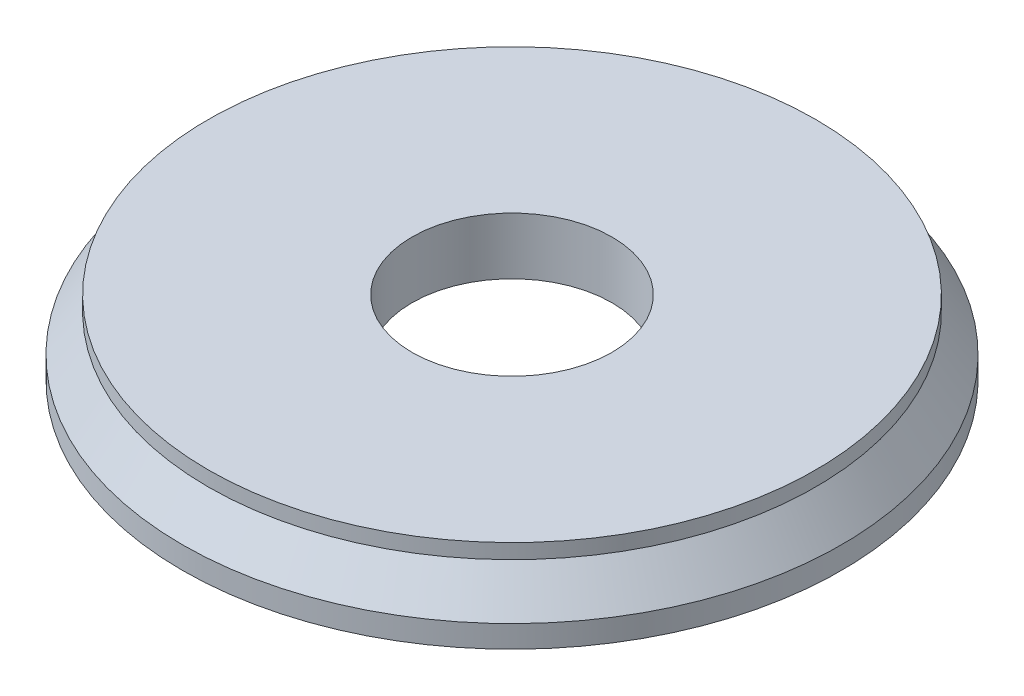
ISO-10303-21;
HEADER;
FILE_DESCRIPTION(('STEP AP214'),'2;1');
FILE_NAME('part.step','',(''),(''),'','','');
FILE_SCHEMA(('AUTOMOTIVE_DESIGN { 1 0 10303 214 1 1 1 1 }'));
ENDSEC;
DATA;
#1=APPLICATION_CONTEXT('core data for automotive mechanical design processes');
#2=APPLICATION_PROTOCOL_DEFINITION('international standard','automotive_design',2000,#1);
#3=PRODUCT_CONTEXT('',#1,'mechanical');
#4=PRODUCT('Part','Part','',(#3));
#5=PRODUCT_RELATED_PRODUCT_CATEGORY('part','',(#4));
#6=PRODUCT_DEFINITION_FORMATION('','',#4);
#7=PRODUCT_DEFINITION_CONTEXT('part definition',#1,'design');
#8=PRODUCT_DEFINITION('design','',#6,#7);
#9=PRODUCT_DEFINITION_SHAPE('','',#8);
#10=(LENGTH_UNIT() NAMED_UNIT(*) SI_UNIT(.MILLI.,.METRE.));
#11=(NAMED_UNIT(*) PLANE_ANGLE_UNIT() SI_UNIT($,.RADIAN.));
#12=(NAMED_UNIT(*) SI_UNIT($,.STERADIAN.) SOLID_ANGLE_UNIT());
#13=UNCERTAINTY_MEASURE_WITH_UNIT(LENGTH_MEASURE(1.E-05),#10,'distance_accuracy_value','');
#14=(GEOMETRIC_REPRESENTATION_CONTEXT(3) GLOBAL_UNCERTAINTY_ASSIGNED_CONTEXT((#13)) GLOBAL_UNIT_ASSIGNED_CONTEXT((#10,
#11,#12)) REPRESENTATION_CONTEXT('',''));
#15=CARTESIAN_POINT('',(0.,0.,0.));
#16=DIRECTION('',(0.,0.,1.));
#17=DIRECTION('',(1.,0.,0.));
#18=AXIS2_PLACEMENT_3D('',#15,#16,#17);
#19=CARTESIAN_POINT('',(0.,0.,0.));
#20=DIRECTION('',(0.,-1.,0.));
#21=DIRECTION('',(0.,0.,-1.));
#22=AXIS2_PLACEMENT_3D('',#19,#20,#21);
#23=CYLINDRICAL_SURFACE('',#22,44.5);
#24=CARTESIAN_POINT('',(0.,3.,0.));
#25=DIRECTION('',(0.,-1.,0.));
#26=DIRECTION('',(0.,0.,-1.));
#27=AXIS2_PLACEMENT_3D('',#24,#25,#26);
#28=CIRCLE('',#27,44.5);
#29=CARTESIAN_POINT('',(0.,3.,-44.5));
#30=VERTEX_POINT('',#29);
#31=EDGE_CURVE('E55',#30,#30,#28,.T.);
#32=ORIENTED_EDGE('',*,*,#31,.T.);
#33=EDGE_LOOP('',(#32));
#34=FACE_BOUND('',#33,.T.);
#35=CARTESIAN_POINT('',(0.,0.,0.));
#36=DIRECTION('',(0.,-1.,0.));
#37=DIRECTION('',(0.,0.,-1.));
#38=AXIS2_PLACEMENT_3D('',#35,#36,#37);
#39=CIRCLE('',#38,44.5);
#40=CARTESIAN_POINT('',(0.,0.,-44.5));
#41=VERTEX_POINT('',#40);
#42=EDGE_CURVE('E40',#41,#41,#39,.T.);
#43=ORIENTED_EDGE('',*,*,#42,.F.);
#44=EDGE_LOOP('',(#43));
#45=FACE_BOUND('',#44,.T.);
#46=ADVANCED_FACE('F29',(#34,#45),#23,.T.);
#47=CARTESIAN_POINT('',(13.5,0.,0.));
#48=DIRECTION('',(0.,-1.,0.));
#49=DIRECTION('',(0.,0.,-1.));
#50=AXIS2_PLACEMENT_3D('',#47,#48,#49);
#51=PLANE('',#50);
#52=CARTESIAN_POINT('',(0.,0.,0.));
#53=DIRECTION('',(0.,-1.,0.));
#54=DIRECTION('',(0.,0.,-1.));
#55=AXIS2_PLACEMENT_3D('',#52,#53,#54);
#56=CIRCLE('',#55,17.5000000000001);
#57=CARTESIAN_POINT('',(0.,0.,-17.5000000000001));
#58=VERTEX_POINT('',#57);
#59=EDGE_CURVE('E10',#58,#58,#56,.F.);
#60=ORIENTED_EDGE('',*,*,#59,.T.);
#61=EDGE_LOOP('',(#60));
#62=FACE_BOUND('',#61,.T.);
#63=ORIENTED_EDGE('',*,*,#42,.T.);
#64=EDGE_LOOP('',(#63));
#65=FACE_BOUND('',#64,.T.);
#66=ADVANCED_FACE('F75',(#62,#65),#51,.T.);
#67=CARTESIAN_POINT('',(0.,0.,0.));
#68=DIRECTION('',(0.,-1.,0.));
#69=DIRECTION('',(0.,0.,-1.));
#70=AXIS2_PLACEMENT_3D('',#67,#68,#69);
#71=CYLINDRICAL_SURFACE('',#70,13.5);
#72=CARTESIAN_POINT('',(0.,2.30940107675853,0.));
#73=DIRECTION('',(0.,-1.,0.));
#74=DIRECTION('',(0.,0.,-1.));
#75=AXIS2_PLACEMENT_3D('',#72,#73,#74);
#76=CIRCLE('',#75,13.5);
#77=CARTESIAN_POINT('',(0.,2.30940107675853,-13.5));
#78=VERTEX_POINT('',#77);
#79=EDGE_CURVE('E36',#78,#78,#76,.T.);
#80=ORIENTED_EDGE('',*,*,#79,.T.);
#81=EDGE_LOOP('',(#80));
#82=FACE_BOUND('',#81,.T.);
#83=CARTESIAN_POINT('',(0.,10.,0.));
#84=DIRECTION('',(0.,-1.,0.));
#85=DIRECTION('',(0.,0.,-1.));
#86=AXIS2_PLACEMENT_3D('',#83,#84,#85);
#87=CIRCLE('',#86,13.5);
#88=CARTESIAN_POINT('',(0.,10.,-13.5));
#89=VERTEX_POINT('',#88);
#90=EDGE_CURVE('E44',#89,#89,#87,.T.);
#91=ORIENTED_EDGE('',*,*,#90,.F.);
#92=EDGE_LOOP('',(#91));
#93=FACE_BOUND('',#92,.T.);
#94=ADVANCED_FACE('F79',(#82,#93),#71,.F.);
#95=CARTESIAN_POINT('',(41.,10.,0.));
#96=DIRECTION('',(0.,1.,0.));
#97=DIRECTION('',(0.,0.,1.));
#98=AXIS2_PLACEMENT_3D('',#95,#96,#97);
#99=PLANE('',#98);
#100=ORIENTED_EDGE('',*,*,#90,.T.);
#101=EDGE_LOOP('',(#100));
#102=FACE_BOUND('',#101,.T.);
#103=CARTESIAN_POINT('',(0.,10.,0.));
#104=DIRECTION('',(0.,-1.,0.));
#105=DIRECTION('',(0.,0.,-1.));
#106=AXIS2_PLACEMENT_3D('',#103,#104,#105);
#107=CIRCLE('',#106,41.);
#108=CARTESIAN_POINT('',(0.,10.,-41.));
#109=VERTEX_POINT('',#108);
#110=EDGE_CURVE('E49',#109,#109,#107,.T.);
#111=ORIENTED_EDGE('',*,*,#110,.F.);
#112=EDGE_LOOP('',(#111));
#113=FACE_BOUND('',#112,.T.);
#114=ADVANCED_FACE('F71',(#102,#113),#99,.T.);
#115=CARTESIAN_POINT('',(0.,0.,0.));
#116=DIRECTION('',(0.,-1.,0.));
#117=DIRECTION('',(0.,0.,-1.));
#118=AXIS2_PLACEMENT_3D('',#115,#116,#117);
#119=CYLINDRICAL_SURFACE('',#118,41.);
#120=ORIENTED_EDGE('',*,*,#110,.T.);
#121=EDGE_LOOP('',(#120));
#122=FACE_BOUND('',#121,.T.);
#123=CARTESIAN_POINT('',(0.,8.,0.));
#124=DIRECTION('',(0.,-1.,0.));
#125=DIRECTION('',(0.,0.,-1.));
#126=AXIS2_PLACEMENT_3D('',#123,#124,#125);
#127=CIRCLE('',#126,41.);
#128=CARTESIAN_POINT('',(0.,8.,-41.));
#129=VERTEX_POINT('',#128);
#130=EDGE_CURVE('E52',#129,#129,#127,.T.);
#131=ORIENTED_EDGE('',*,*,#130,.F.);
#132=EDGE_LOOP('',(#131));
#133=FACE_BOUND('',#132,.T.);
#134=ADVANCED_FACE('F63',(#122,#133),#119,.T.);
#135=CARTESIAN_POINT('',(0.,3.,0.));
#136=DIRECTION('',(0.,-1.,0.));
#137=DIRECTION('',(0.,0.,-1.));
#138=AXIS2_PLACEMENT_3D('',#135,#136,#137);
#139=CONICAL_SURFACE('',#138,44.5,0.610725964389208);
#140=ORIENTED_EDGE('',*,*,#130,.T.);
#141=EDGE_LOOP('',(#140));
#142=FACE_BOUND('',#141,.T.);
#143=ORIENTED_EDGE('',*,*,#31,.F.);
#144=EDGE_LOOP('',(#143));
#145=FACE_BOUND('',#144,.T.);
#146=ADVANCED_FACE('F61',(#142,#145),#139,.T.);
#147=CARTESIAN_POINT('',(0.,2.30940107675853,0.));
#148=DIRECTION('',(0.,-1.,0.));
#149=DIRECTION('',(0.,0.,-1.));
#150=AXIS2_PLACEMENT_3D('',#147,#148,#149);
#151=CONICAL_SURFACE('',#150,13.5,1.0471975511966);
#152=ORIENTED_EDGE('',*,*,#59,.F.);
#153=EDGE_LOOP('',(#152));
#154=FACE_BOUND('',#153,.T.);
#155=ORIENTED_EDGE('',*,*,#79,.F.);
#156=EDGE_LOOP('',(#155));
#157=FACE_BOUND('',#156,.T.);
#158=ADVANCED_FACE('F31',(#154,#157),#151,.F.);
#159=CLOSED_SHELL('',(#46,#66,#94,#114,#134,#146,#158));
#160=MANIFOLD_SOLID_BREP('B2',#159);
#161=ADVANCED_BREP_SHAPE_REPRESENTATION('',(#18,#160),#14);
#162=SHAPE_DEFINITION_REPRESENTATION(#9,#161);
ENDSEC;
END-ISO-10303-21;
